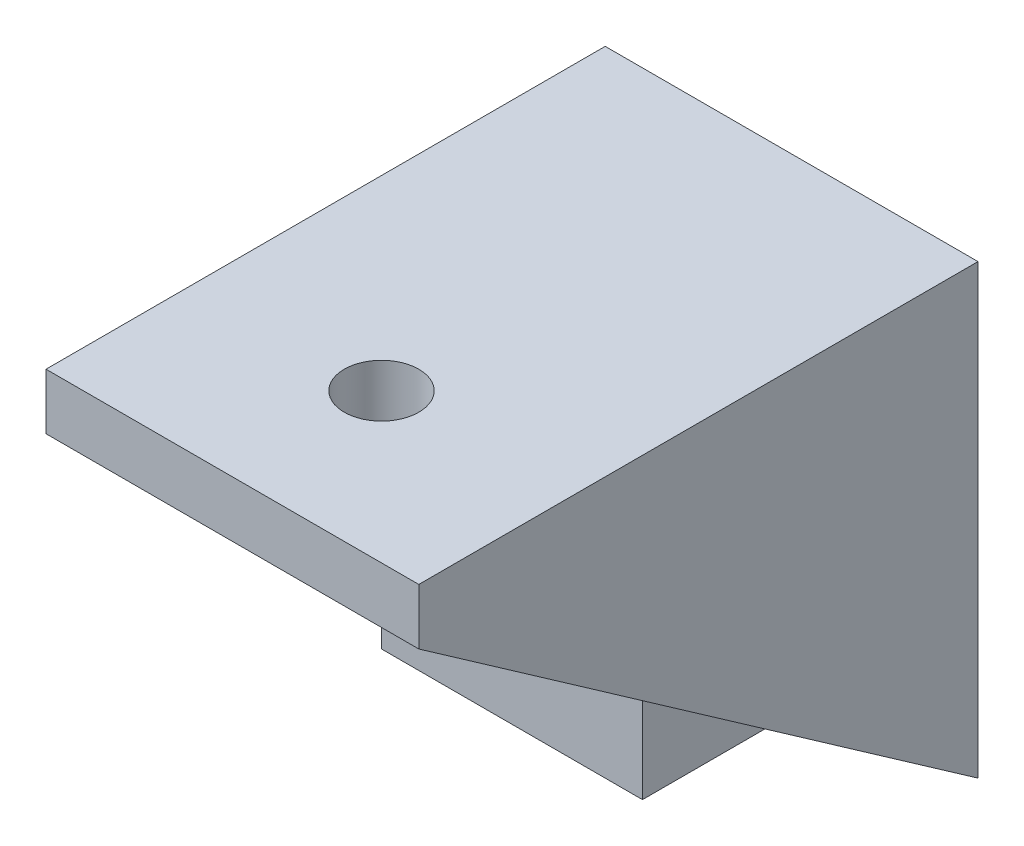
ISO-10303-21;
HEADER;
FILE_DESCRIPTION(('STEP AP214'),'2;1');
FILE_NAME('part.step','',(''),(''),'','','');
FILE_SCHEMA(('AUTOMOTIVE_DESIGN { 1 0 10303 214 1 1 1 1 }'));
ENDSEC;
DATA;
#1=APPLICATION_CONTEXT('core data for automotive mechanical design processes');
#2=APPLICATION_PROTOCOL_DEFINITION('international standard','automotive_design',2000,#1);
#3=PRODUCT_CONTEXT('',#1,'mechanical');
#4=PRODUCT('Part','Part','',(#3));
#5=PRODUCT_RELATED_PRODUCT_CATEGORY('part','',(#4));
#6=PRODUCT_DEFINITION_FORMATION('','',#4);
#7=PRODUCT_DEFINITION_CONTEXT('part definition',#1,'design');
#8=PRODUCT_DEFINITION('design','',#6,#7);
#9=PRODUCT_DEFINITION_SHAPE('','',#8);
#10=(LENGTH_UNIT() NAMED_UNIT(*) SI_UNIT(.MILLI.,.METRE.));
#11=(NAMED_UNIT(*) PLANE_ANGLE_UNIT() SI_UNIT($,.RADIAN.));
#12=(NAMED_UNIT(*) SI_UNIT($,.STERADIAN.) SOLID_ANGLE_UNIT());
#13=UNCERTAINTY_MEASURE_WITH_UNIT(LENGTH_MEASURE(1.E-05),#10,'distance_accuracy_value','');
#14=(GEOMETRIC_REPRESENTATION_CONTEXT(3) GLOBAL_UNCERTAINTY_ASSIGNED_CONTEXT((#13)) GLOBAL_UNIT_ASSIGNED_CONTEXT((#10,
#11,#12)) REPRESENTATION_CONTEXT('',''));
#15=CARTESIAN_POINT('',(0.,0.,0.));
#16=DIRECTION('',(0.,0.,1.));
#17=DIRECTION('',(1.,0.,0.));
#18=AXIS2_PLACEMENT_3D('',#15,#16,#17);
#19=CARTESIAN_POINT('',(0.,0.,3.));
#20=DIRECTION('',(0.,0.,1.));
#21=DIRECTION('',(1.,0.,0.));
#22=AXIS2_PLACEMENT_3D('',#19,#20,#21);
#23=PLANE('',#22);
#24=DIRECTION('',(1.,0.,0.));
#25=VECTOR('',#24,1.);
#26=CARTESIAN_POINT('',(-10.,-9.9,3.));
#27=LINE('',#26,#25);
#28=CARTESIAN_POINT('',(-8.,-9.9,3.));
#29=VERTEX_POINT('',#28);
#30=CARTESIAN_POINT('',(8.,-9.9,3.));
#31=VERTEX_POINT('',#30);
#32=EDGE_CURVE('E193',#29,#31,#27,.T.);
#33=ORIENTED_EDGE('',*,*,#32,.T.);
#34=DIRECTION('',(0.,-1.,0.));
#35=VECTOR('',#34,1.);
#36=CARTESIAN_POINT('',(8.,0.,3.));
#37=LINE('',#36,#35);
#38=CARTESIAN_POINT('',(8.,9.,3.));
#39=VERTEX_POINT('',#38);
#40=EDGE_CURVE('E145',#39,#31,#37,.T.);
#41=ORIENTED_EDGE('',*,*,#40,.F.);
#42=DIRECTION('',(1.,0.,0.));
#43=VECTOR('',#42,1.);
#44=CARTESIAN_POINT('',(0.,9.,3.));
#45=LINE('',#44,#43);
#46=CARTESIAN_POINT('',(-8.,9.,3.));
#47=VERTEX_POINT('',#46);
#48=EDGE_CURVE('E152',#47,#39,#45,.T.);
#49=ORIENTED_EDGE('',*,*,#48,.F.);
#50=DIRECTION('',(0.,-1.,0.));
#51=VECTOR('',#50,1.);
#52=CARTESIAN_POINT('',(-8.,0.,3.));
#53=LINE('',#52,#51);
#54=EDGE_CURVE('E154',#47,#29,#53,.T.);
#55=ORIENTED_EDGE('',*,*,#54,.T.);
#56=EDGE_LOOP('',(#33,#41,#49,#55));
#57=FACE_BOUND('',#56,.T.);
#58=DIRECTION('',(-1.,0.,0.));
#59=VECTOR('',#58,1.);
#60=CARTESIAN_POINT('',(-7.,7.,3.));
#61=LINE('',#60,#59);
#62=CARTESIAN_POINT('',(7.,7.,3.));
#63=VERTEX_POINT('',#62);
#64=CARTESIAN_POINT('',(-7.,7.,3.));
#65=VERTEX_POINT('',#64);
#66=EDGE_CURVE('E272',#63,#65,#61,.T.);
#67=ORIENTED_EDGE('',*,*,#66,.F.);
#68=DIRECTION('',(0.,1.,0.));
#69=VECTOR('',#68,1.);
#70=CARTESIAN_POINT('',(7.,-7.,3.));
#71=LINE('',#70,#69);
#72=CARTESIAN_POINT('',(7.,-7.,3.));
#73=VERTEX_POINT('',#72);
#74=EDGE_CURVE('E140',#73,#63,#71,.T.);
#75=ORIENTED_EDGE('',*,*,#74,.F.);
#76=DIRECTION('',(1.,0.,0.));
#77=VECTOR('',#76,1.);
#78=CARTESIAN_POINT('',(-7.,-7.,3.));
#79=LINE('',#78,#77);
#80=CARTESIAN_POINT('',(-7.,-7.,3.));
#81=VERTEX_POINT('',#80);
#82=EDGE_CURVE('E136',#81,#73,#79,.T.);
#83=ORIENTED_EDGE('',*,*,#82,.F.);
#84=DIRECTION('',(0.,-1.,0.));
#85=VECTOR('',#84,1.);
#86=CARTESIAN_POINT('',(-7.,-7.,3.));
#87=LINE('',#86,#85);
#88=EDGE_CURVE('E274',#65,#81,#87,.T.);
#89=ORIENTED_EDGE('',*,*,#88,.F.);
#90=EDGE_LOOP('',(#67,#75,#83,#89));
#91=FACE_BOUND('',#90,.T.);
#92=ADVANCED_FACE('F33',(#57,#91),#23,.T.);
#93=CARTESIAN_POINT('',(-10.,-12.,0.));
#94=DIRECTION('',(0.,0.81923192051904,-0.573462344363328));
#95=DIRECTION('',(0.,0.573462344363328,0.81923192051904));
#96=AXIS2_PLACEMENT_3D('',#93,#94,#95);
#97=PLANE('',#96);
#98=DIRECTION('',(0.,0.573462344363328,0.81923192051904));
#99=VECTOR('',#98,1.);
#100=CARTESIAN_POINT('',(8.,-12.,0.));
#101=LINE('',#100,#99);
#102=CARTESIAN_POINT('',(7.99999999999999,9.,30.));
#103=VERTEX_POINT('',#102);
#104=EDGE_CURVE('E11',#31,#103,#101,.T.);
#105=ORIENTED_EDGE('',*,*,#104,.F.);
#106=ORIENTED_EDGE('',*,*,#32,.F.);
#107=DIRECTION('',(0.,0.573462344363328,0.81923192051904));
#108=VECTOR('',#107,1.);
#109=CARTESIAN_POINT('',(-8.,-12.,0.));
#110=LINE('',#109,#108);
#111=CARTESIAN_POINT('',(-8.,9.,30.));
#112=VERTEX_POINT('',#111);
#113=EDGE_CURVE('E42',#29,#112,#110,.T.);
#114=ORIENTED_EDGE('',*,*,#113,.T.);
#115=DIRECTION('',(1.,0.,0.));
#116=VECTOR('',#115,1.);
#117=CARTESIAN_POINT('',(-10.,9.,30.));
#118=LINE('',#117,#116);
#119=CARTESIAN_POINT('',(-10.,9.,30.));
#120=VERTEX_POINT('',#119);
#121=EDGE_CURVE('E167',#120,#112,#118,.T.);
#122=ORIENTED_EDGE('',*,*,#121,.F.);
#123=DIRECTION('',(0.,0.573462344363328,0.81923192051904));
#124=VECTOR('',#123,1.);
#125=CARTESIAN_POINT('',(-10.,-12.,0.));
#126=LINE('',#125,#124);
#127=CARTESIAN_POINT('',(-10.,-12.,0.));
#128=VERTEX_POINT('',#127);
#129=EDGE_CURVE('E161',#128,#120,#126,.T.);
#130=ORIENTED_EDGE('',*,*,#129,.F.);
#131=DIRECTION('',(1.,0.,0.));
#132=VECTOR('',#131,1.);
#133=CARTESIAN_POINT('',(-10.,-12.,0.));
#134=LINE('',#133,#132);
#135=CARTESIAN_POINT('',(10.,-12.,0.));
#136=VERTEX_POINT('',#135);
#137=EDGE_CURVE('E174',#128,#136,#134,.T.);
#138=ORIENTED_EDGE('',*,*,#137,.T.);
#139=DIRECTION('',(0.,0.573462344363328,0.81923192051904));
#140=VECTOR('',#139,1.);
#141=CARTESIAN_POINT('',(10.,-12.,0.));
#142=LINE('',#141,#140);
#143=CARTESIAN_POINT('',(10.,9.,30.));
#144=VERTEX_POINT('',#143);
#145=EDGE_CURVE('E159',#136,#144,#142,.T.);
#146=ORIENTED_EDGE('',*,*,#145,.T.);
#147=EDGE_CURVE('E164',#103,#144,#118,.T.);
#148=ORIENTED_EDGE('',*,*,#147,.F.);
#149=EDGE_LOOP('',(#105,#106,#114,#122,#130,#138,#146,#148));
#150=FACE_BOUND('',#149,.T.);
#151=ADVANCED_FACE('F199',(#150),#97,.F.);
#152=CARTESIAN_POINT('',(10.,-12.,30.));
#153=DIRECTION('',(-1.,0.,0.));
#154=DIRECTION('',(0.,0.,1.));
#155=AXIS2_PLACEMENT_3D('',#152,#153,#154);
#156=PLANE('',#155);
#157=DIRECTION('',(0.,1.,0.));
#158=VECTOR('',#157,1.);
#159=CARTESIAN_POINT('',(10.,-12.,30.));
#160=LINE('',#159,#158);
#161=CARTESIAN_POINT('',(10.,12.,30.));
#162=VERTEX_POINT('',#161);
#163=EDGE_CURVE('E171',#144,#162,#160,.T.);
#164=ORIENTED_EDGE('',*,*,#163,.F.);
#165=ORIENTED_EDGE('',*,*,#145,.F.);
#166=DIRECTION('',(0.,1.,0.));
#167=VECTOR('',#166,1.);
#168=CARTESIAN_POINT('',(10.,-12.,0.));
#169=LINE('',#168,#167);
#170=CARTESIAN_POINT('',(10.,12.,0.));
#171=VERTEX_POINT('',#170);
#172=EDGE_CURVE('E170',#136,#171,#169,.T.);
#173=ORIENTED_EDGE('',*,*,#172,.T.);
#174=DIRECTION('',(0.,0.,-1.));
#175=VECTOR('',#174,1.);
#176=CARTESIAN_POINT('',(10.,12.,30.));
#177=LINE('',#176,#175);
#178=EDGE_CURVE('E190',#162,#171,#177,.T.);
#179=ORIENTED_EDGE('',*,*,#178,.F.);
#180=EDGE_LOOP('',(#164,#165,#173,#179));
#181=FACE_BOUND('',#180,.T.);
#182=ADVANCED_FACE('F35',(#181),#156,.F.);
#183=CARTESIAN_POINT('',(-10.,12.,30.));
#184=DIRECTION('',(0.,-1.,0.));
#185=DIRECTION('',(0.,0.,-1.));
#186=AXIS2_PLACEMENT_3D('',#183,#184,#185);
#187=PLANE('',#186);
#188=CARTESIAN_POINT('',(0.,12.,22.));
#189=DIRECTION('',(0.,-1.,0.));
#190=DIRECTION('',(0.,0.,-1.));
#191=AXIS2_PLACEMENT_3D('',#188,#189,#190);
#192=CIRCLE('',#191,2.);
#193=CARTESIAN_POINT('',(0.,12.,20.));
#194=VERTEX_POINT('',#193);
#195=EDGE_CURVE('E261',#194,#194,#192,.T.);
#196=ORIENTED_EDGE('',*,*,#195,.T.);
#197=EDGE_LOOP('',(#196));
#198=FACE_BOUND('',#197,.T.);
#199=DIRECTION('',(-1.,0.,0.));
#200=VECTOR('',#199,1.);
#201=CARTESIAN_POINT('',(-10.,12.,0.));
#202=LINE('',#201,#200);
#203=CARTESIAN_POINT('',(-10.,12.,0.));
#204=VERTEX_POINT('',#203);
#205=EDGE_CURVE('E182',#171,#204,#202,.T.);
#206=ORIENTED_EDGE('',*,*,#205,.T.);
#207=DIRECTION('',(0.,0.,-1.));
#208=VECTOR('',#207,1.);
#209=CARTESIAN_POINT('',(-10.,12.,30.));
#210=LINE('',#209,#208);
#211=CARTESIAN_POINT('',(-10.,12.,30.));
#212=VERTEX_POINT('',#211);
#213=EDGE_CURVE('E179',#212,#204,#210,.T.);
#214=ORIENTED_EDGE('',*,*,#213,.F.);
#215=DIRECTION('',(-1.,0.,0.));
#216=VECTOR('',#215,1.);
#217=CARTESIAN_POINT('',(-10.,12.,30.));
#218=LINE('',#217,#216);
#219=EDGE_CURVE('E173',#162,#212,#218,.T.);
#220=ORIENTED_EDGE('',*,*,#219,.F.);
#221=ORIENTED_EDGE('',*,*,#178,.T.);
#222=EDGE_LOOP('',(#206,#214,#220,#221));
#223=FACE_BOUND('',#222,.T.);
#224=ADVANCED_FACE('F220',(#198,#223),#187,.F.);
#225=CARTESIAN_POINT('',(-10.,-12.,30.));
#226=DIRECTION('',(1.,0.,0.));
#227=DIRECTION('',(0.,0.,-1.));
#228=AXIS2_PLACEMENT_3D('',#225,#226,#227);
#229=PLANE('',#228);
#230=DIRECTION('',(0.,-1.,0.));
#231=VECTOR('',#230,1.);
#232=CARTESIAN_POINT('',(-10.,-12.,0.));
#233=LINE('',#232,#231);
#234=EDGE_CURVE('E184',#204,#128,#233,.T.);
#235=ORIENTED_EDGE('',*,*,#234,.T.);
#236=ORIENTED_EDGE('',*,*,#129,.T.);
#237=DIRECTION('',(0.,-1.,0.));
#238=VECTOR('',#237,1.);
#239=CARTESIAN_POINT('',(-10.,-12.,30.));
#240=LINE('',#239,#238);
#241=EDGE_CURVE('E176',#212,#120,#240,.T.);
#242=ORIENTED_EDGE('',*,*,#241,.F.);
#243=ORIENTED_EDGE('',*,*,#213,.T.);
#244=EDGE_LOOP('',(#235,#236,#242,#243));
#245=FACE_BOUND('',#244,.T.);
#246=ADVANCED_FACE('F208',(#245),#229,.F.);
#247=CARTESIAN_POINT('',(0.,0.,30.));
#248=DIRECTION('',(0.,0.,-1.));
#249=DIRECTION('',(-1.,0.,0.));
#250=AXIS2_PLACEMENT_3D('',#247,#248,#249);
#251=PLANE('',#250);
#252=ORIENTED_EDGE('',*,*,#241,.T.);
#253=ORIENTED_EDGE('',*,*,#121,.T.);
#254=DIRECTION('',(1.,0.,0.));
#255=VECTOR('',#254,1.);
#256=CARTESIAN_POINT('',(0.,9.,30.));
#257=LINE('',#256,#255);
#258=EDGE_CURVE('E142',#112,#103,#257,.T.);
#259=ORIENTED_EDGE('',*,*,#258,.T.);
#260=ORIENTED_EDGE('',*,*,#147,.T.);
#261=ORIENTED_EDGE('',*,*,#163,.T.);
#262=ORIENTED_EDGE('',*,*,#219,.T.);
#263=EDGE_LOOP('',(#252,#253,#259,#260,#261,#262));
#264=FACE_BOUND('',#263,.T.);
#265=ADVANCED_FACE('F203',(#264),#251,.F.);
#266=CARTESIAN_POINT('',(0.,0.,0.));
#267=DIRECTION('',(0.,0.,-1.));
#268=DIRECTION('',(-1.,0.,0.));
#269=AXIS2_PLACEMENT_3D('',#266,#267,#268);
#270=PLANE('',#269);
#271=CARTESIAN_POINT('',(0.,0.,0.));
#272=DIRECTION('',(0.,0.,-1.));
#273=DIRECTION('',(-1.,0.,0.));
#274=AXIS2_PLACEMENT_3D('',#271,#272,#273);
#275=CIRCLE('',#274,1.6);
#276=CARTESIAN_POINT('',(-1.6,0.,0.));
#277=VERTEX_POINT('',#276);
#278=EDGE_CURVE('E259',#277,#277,#275,.T.);
#279=ORIENTED_EDGE('',*,*,#278,.F.);
#280=EDGE_LOOP('',(#279));
#281=FACE_BOUND('',#280,.T.);
#282=ORIENTED_EDGE('',*,*,#172,.F.);
#283=ORIENTED_EDGE('',*,*,#137,.F.);
#284=ORIENTED_EDGE('',*,*,#234,.F.);
#285=ORIENTED_EDGE('',*,*,#205,.F.);
#286=EDGE_LOOP('',(#282,#283,#284,#285));
#287=FACE_BOUND('',#286,.T.);
#288=ADVANCED_FACE('F218',(#281,#287),#270,.T.);
#289=CARTESIAN_POINT('',(8.,0.,3.));
#290=DIRECTION('',(-1.,0.,0.));
#291=DIRECTION('',(0.,-1.,0.));
#292=AXIS2_PLACEMENT_3D('',#289,#290,#291);
#293=PLANE('',#292);
#294=ORIENTED_EDGE('',*,*,#104,.T.);
#295=DIRECTION('',(0.,0.,1.));
#296=VECTOR('',#295,1.);
#297=CARTESIAN_POINT('',(8.,9.,3.));
#298=LINE('',#297,#296);
#299=EDGE_CURVE('E57',#39,#103,#298,.T.);
#300=ORIENTED_EDGE('',*,*,#299,.F.);
#301=ORIENTED_EDGE('',*,*,#40,.T.);
#302=EDGE_LOOP('',(#294,#300,#301));
#303=FACE_BOUND('',#302,.T.);
#304=ADVANCED_FACE('F244',(#303),#293,.T.);
#305=CARTESIAN_POINT('',(-8.,0.,3.));
#306=DIRECTION('',(-1.,0.,0.));
#307=DIRECTION('',(0.,-1.,0.));
#308=AXIS2_PLACEMENT_3D('',#305,#306,#307);
#309=PLANE('',#308);
#310=ORIENTED_EDGE('',*,*,#54,.F.);
#311=DIRECTION('',(0.,0.,1.));
#312=VECTOR('',#311,1.);
#313=CARTESIAN_POINT('',(-8.,9.,3.));
#314=LINE('',#313,#312);
#315=EDGE_CURVE('E157',#47,#112,#314,.T.);
#316=ORIENTED_EDGE('',*,*,#315,.T.);
#317=ORIENTED_EDGE('',*,*,#113,.F.);
#318=EDGE_LOOP('',(#310,#316,#317));
#319=FACE_BOUND('',#318,.T.);
#320=ADVANCED_FACE('F240',(#319),#309,.F.);
#321=CARTESIAN_POINT('',(0.,9.,3.));
#322=DIRECTION('',(0.,-1.,0.));
#323=DIRECTION('',(0.,0.,-1.));
#324=AXIS2_PLACEMENT_3D('',#321,#322,#323);
#325=PLANE('',#324);
#326=CARTESIAN_POINT('',(0.,9.,22.));
#327=DIRECTION('',(0.,-1.,0.));
#328=DIRECTION('',(0.,0.,-1.));
#329=AXIS2_PLACEMENT_3D('',#326,#327,#328);
#330=CIRCLE('',#329,2.);
#331=CARTESIAN_POINT('',(0.,9.,20.));
#332=VERTEX_POINT('',#331);
#333=EDGE_CURVE('E264',#332,#332,#330,.T.);
#334=ORIENTED_EDGE('',*,*,#333,.F.);
#335=EDGE_LOOP('',(#334));
#336=FACE_BOUND('',#335,.T.);
#337=ORIENTED_EDGE('',*,*,#258,.F.);
#338=ORIENTED_EDGE('',*,*,#315,.F.);
#339=ORIENTED_EDGE('',*,*,#48,.T.);
#340=ORIENTED_EDGE('',*,*,#299,.T.);
#341=EDGE_LOOP('',(#337,#338,#339,#340));
#342=FACE_BOUND('',#341,.T.);
#343=ADVANCED_FACE('F243',(#336,#342),#325,.T.);
#344=CARTESIAN_POINT('',(7.,-7.,15.));
#345=DIRECTION('',(-1.,0.,0.));
#346=DIRECTION('',(0.,0.,1.));
#347=AXIS2_PLACEMENT_3D('',#344,#345,#346);
#348=PLANE('',#347);
#349=ORIENTED_EDGE('',*,*,#74,.T.);
#350=DIRECTION('',(0.,0.,-1.));
#351=VECTOR('',#350,1.);
#352=CARTESIAN_POINT('',(7.,7.,15.));
#353=LINE('',#352,#351);
#354=CARTESIAN_POINT('',(7.,7.,15.));
#355=VERTEX_POINT('',#354);
#356=EDGE_CURVE('E121',#355,#63,#353,.T.);
#357=ORIENTED_EDGE('',*,*,#356,.F.);
#358=DIRECTION('',(0.,1.,0.));
#359=VECTOR('',#358,1.);
#360=CARTESIAN_POINT('',(7.,-7.,15.));
#361=LINE('',#360,#359);
#362=CARTESIAN_POINT('',(7.,-7.,15.));
#363=VERTEX_POINT('',#362);
#364=EDGE_CURVE('E128',#363,#355,#361,.T.);
#365=ORIENTED_EDGE('',*,*,#364,.F.);
#366=DIRECTION('',(0.,0.,-1.));
#367=VECTOR('',#366,1.);
#368=CARTESIAN_POINT('',(7.,-7.,15.));
#369=LINE('',#368,#367);
#370=EDGE_CURVE('E270',#363,#73,#369,.T.);
#371=ORIENTED_EDGE('',*,*,#370,.T.);
#372=EDGE_LOOP('',(#349,#357,#365,#371));
#373=FACE_BOUND('',#372,.T.);
#374=ADVANCED_FACE('F138',(#373),#348,.F.);
#375=CARTESIAN_POINT('',(-7.,7.,15.));
#376=DIRECTION('',(0.,-1.,0.));
#377=DIRECTION('',(0.,0.,-1.));
#378=AXIS2_PLACEMENT_3D('',#375,#376,#377);
#379=PLANE('',#378);
#380=ORIENTED_EDGE('',*,*,#66,.T.);
#381=DIRECTION('',(0.,0.,-1.));
#382=VECTOR('',#381,1.);
#383=CARTESIAN_POINT('',(-7.,7.,15.));
#384=LINE('',#383,#382);
#385=CARTESIAN_POINT('',(-7.,7.,15.));
#386=VERTEX_POINT('',#385);
#387=EDGE_CURVE('E124',#386,#65,#384,.T.);
#388=ORIENTED_EDGE('',*,*,#387,.F.);
#389=DIRECTION('',(-1.,0.,0.));
#390=VECTOR('',#389,1.);
#391=CARTESIAN_POINT('',(-7.,7.,15.));
#392=LINE('',#391,#390);
#393=EDGE_CURVE('E117',#355,#386,#392,.T.);
#394=ORIENTED_EDGE('',*,*,#393,.F.);
#395=ORIENTED_EDGE('',*,*,#356,.T.);
#396=EDGE_LOOP('',(#380,#388,#394,#395));
#397=FACE_BOUND('',#396,.T.);
#398=ADVANCED_FACE('F119',(#397),#379,.F.);
#399=CARTESIAN_POINT('',(-7.,-7.,15.));
#400=DIRECTION('',(1.,0.,0.));
#401=DIRECTION('',(0.,0.,-1.));
#402=AXIS2_PLACEMENT_3D('',#399,#400,#401);
#403=PLANE('',#402);
#404=ORIENTED_EDGE('',*,*,#88,.T.);
#405=DIRECTION('',(0.,0.,-1.));
#406=VECTOR('',#405,1.);
#407=CARTESIAN_POINT('',(-7.,-7.,15.));
#408=LINE('',#407,#406);
#409=CARTESIAN_POINT('',(-7.,-7.,15.));
#410=VERTEX_POINT('',#409);
#411=EDGE_CURVE('E49',#410,#81,#408,.T.);
#412=ORIENTED_EDGE('',*,*,#411,.F.);
#413=DIRECTION('',(0.,-1.,0.));
#414=VECTOR('',#413,1.);
#415=CARTESIAN_POINT('',(-7.,-7.,15.));
#416=LINE('',#415,#414);
#417=EDGE_CURVE('E127',#386,#410,#416,.T.);
#418=ORIENTED_EDGE('',*,*,#417,.F.);
#419=ORIENTED_EDGE('',*,*,#387,.T.);
#420=EDGE_LOOP('',(#404,#412,#418,#419));
#421=FACE_BOUND('',#420,.T.);
#422=ADVANCED_FACE('F280',(#421),#403,.F.);
#423=CARTESIAN_POINT('',(-7.,-7.,15.));
#424=DIRECTION('',(0.,1.,0.));
#425=DIRECTION('',(-1.,0.,0.));
#426=AXIS2_PLACEMENT_3D('',#423,#424,#425);
#427=PLANE('',#426);
#428=ORIENTED_EDGE('',*,*,#82,.T.);
#429=ORIENTED_EDGE('',*,*,#370,.F.);
#430=DIRECTION('',(1.,0.,0.));
#431=VECTOR('',#430,1.);
#432=CARTESIAN_POINT('',(-7.,-7.,15.));
#433=LINE('',#432,#431);
#434=EDGE_CURVE('E132',#410,#363,#433,.T.);
#435=ORIENTED_EDGE('',*,*,#434,.F.);
#436=ORIENTED_EDGE('',*,*,#411,.T.);
#437=EDGE_LOOP('',(#428,#429,#435,#436));
#438=FACE_BOUND('',#437,.T.);
#439=ADVANCED_FACE('F281',(#438),#427,.F.);
#440=CARTESIAN_POINT('',(0.,0.,15.));
#441=DIRECTION('',(0.,0.,-1.));
#442=DIRECTION('',(-1.,0.,0.));
#443=AXIS2_PLACEMENT_3D('',#440,#441,#442);
#444=PLANE('',#443);
#445=CARTESIAN_POINT('',(0.,0.,15.));
#446=DIRECTION('',(0.,0.,-1.));
#447=DIRECTION('',(-1.,0.,0.));
#448=AXIS2_PLACEMENT_3D('',#445,#446,#447);
#449=CIRCLE('',#448,1.6);
#450=CARTESIAN_POINT('',(-1.6,0.,15.));
#451=VERTEX_POINT('',#450);
#452=EDGE_CURVE('E37',#451,#451,#449,.T.);
#453=ORIENTED_EDGE('',*,*,#452,.T.);
#454=EDGE_LOOP('',(#453));
#455=FACE_BOUND('',#454,.T.);
#456=ORIENTED_EDGE('',*,*,#364,.T.);
#457=ORIENTED_EDGE('',*,*,#393,.T.);
#458=ORIENTED_EDGE('',*,*,#417,.T.);
#459=ORIENTED_EDGE('',*,*,#434,.T.);
#460=EDGE_LOOP('',(#456,#457,#458,#459));
#461=FACE_BOUND('',#460,.T.);
#462=ADVANCED_FACE('F131',(#455,#461),#444,.F.);
#463=CARTESIAN_POINT('',(0.,0.,30.));
#464=DIRECTION('',(0.,0.,-1.));
#465=DIRECTION('',(-1.,0.,0.));
#466=AXIS2_PLACEMENT_3D('',#463,#464,#465);
#467=CYLINDRICAL_SURFACE('',#466,1.6);
#468=ORIENTED_EDGE('',*,*,#278,.T.);
#469=EDGE_LOOP('',(#468));
#470=FACE_BOUND('',#469,.T.);
#471=ORIENTED_EDGE('',*,*,#452,.F.);
#472=EDGE_LOOP('',(#471));
#473=FACE_BOUND('',#472,.T.);
#474=ADVANCED_FACE('F288',(#470,#473),#467,.F.);
#475=CARTESIAN_POINT('',(0.,12.,22.));
#476=DIRECTION('',(0.,-1.,0.));
#477=DIRECTION('',(0.,0.,-1.));
#478=AXIS2_PLACEMENT_3D('',#475,#476,#477);
#479=CYLINDRICAL_SURFACE('',#478,2.);
#480=ORIENTED_EDGE('',*,*,#195,.F.);
#481=EDGE_LOOP('',(#480));
#482=FACE_BOUND('',#481,.T.);
#483=ORIENTED_EDGE('',*,*,#333,.T.);
#484=EDGE_LOOP('',(#483));
#485=FACE_BOUND('',#484,.T.);
#486=ADVANCED_FACE('F350',(#482,#485),#479,.F.);
#487=CLOSED_SHELL('',(#92,#151,#182,#224,#246,#265,#288,#304,#320,#343,#374,#398,#422,#439,#462,
#474,#486));
#488=MANIFOLD_SOLID_BREP('B2',#487);
#489=ADVANCED_BREP_SHAPE_REPRESENTATION('',(#18,#488),#14);
#490=SHAPE_DEFINITION_REPRESENTATION(#9,#489);
ENDSEC;
END-ISO-10303-21;
